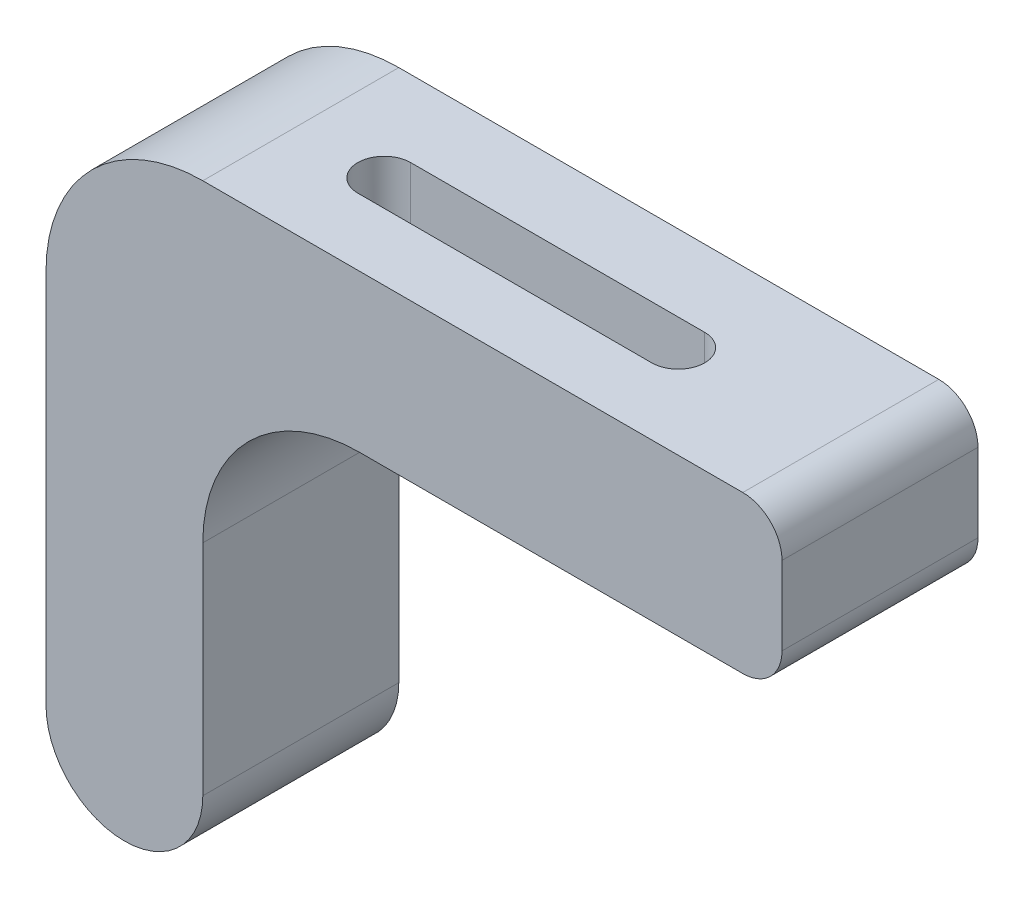
ISO-10303-21;
HEADER;
FILE_DESCRIPTION(('STEP AP214'),'2;1');
FILE_NAME('part.step','',(''),(''),'','','');
FILE_SCHEMA(('AUTOMOTIVE_DESIGN { 1 0 10303 214 1 1 1 1 }'));
ENDSEC;
DATA;
#1=APPLICATION_CONTEXT('core data for automotive mechanical design processes');
#2=APPLICATION_PROTOCOL_DEFINITION('international standard','automotive_design',2000,#1);
#3=PRODUCT_CONTEXT('',#1,'mechanical');
#4=PRODUCT('Part','Part','',(#3));
#5=PRODUCT_RELATED_PRODUCT_CATEGORY('part','',(#4));
#6=PRODUCT_DEFINITION_FORMATION('','',#4);
#7=PRODUCT_DEFINITION_CONTEXT('part definition',#1,'design');
#8=PRODUCT_DEFINITION('design','',#6,#7);
#9=PRODUCT_DEFINITION_SHAPE('','',#8);
#10=(LENGTH_UNIT() NAMED_UNIT(*) SI_UNIT(.MILLI.,.METRE.));
#11=(NAMED_UNIT(*) PLANE_ANGLE_UNIT() SI_UNIT($,.RADIAN.));
#12=(NAMED_UNIT(*) SI_UNIT($,.STERADIAN.) SOLID_ANGLE_UNIT());
#13=UNCERTAINTY_MEASURE_WITH_UNIT(LENGTH_MEASURE(1.E-05),#10,'distance_accuracy_value','');
#14=(GEOMETRIC_REPRESENTATION_CONTEXT(3) GLOBAL_UNCERTAINTY_ASSIGNED_CONTEXT((#13)) GLOBAL_UNIT_ASSIGNED_CONTEXT((#10,
#11,#12)) REPRESENTATION_CONTEXT('',''));
#15=CARTESIAN_POINT('',(0.,0.,0.));
#16=DIRECTION('',(0.,0.,1.));
#17=DIRECTION('',(1.,0.,0.));
#18=AXIS2_PLACEMENT_3D('',#15,#16,#17);
#19=CARTESIAN_POINT('',(4.,25.1351603178812,10.));
#20=DIRECTION('',(0.,0.,-1.));
#21=DIRECTION('',(-1.,0.,0.));
#22=AXIS2_PLACEMENT_3D('',#19,#20,#21);
#23=CYLINDRICAL_SURFACE('',#22,4.);
#24=CARTESIAN_POINT('',(4.,25.1351603178812,0.));
#25=DIRECTION('',(0.,0.,1.));
#26=DIRECTION('',(1.,0.,0.));
#27=AXIS2_PLACEMENT_3D('',#24,#25,#26);
#28=CIRCLE('',#27,4.);
#29=CARTESIAN_POINT('',(0.,25.1351603178812,0.));
#30=VERTEX_POINT('',#29);
#31=CARTESIAN_POINT('',(8.,25.1351603178812,0.));
#32=VERTEX_POINT('',#31);
#33=EDGE_CURVE('E252',#30,#32,#28,.T.);
#34=ORIENTED_EDGE('',*,*,#33,.T.);
#35=DIRECTION('',(0.,0.,-1.));
#36=VECTOR('',#35,1.);
#37=CARTESIAN_POINT('',(8.,25.1351603178812,10.));
#38=LINE('',#37,#36);
#39=CARTESIAN_POINT('',(8.,25.1351603178812,10.));
#40=VERTEX_POINT('',#39);
#41=EDGE_CURVE('E323',#40,#32,#38,.T.);
#42=ORIENTED_EDGE('',*,*,#41,.F.);
#43=CARTESIAN_POINT('',(4.,25.1351603178812,10.));
#44=DIRECTION('',(0.,0.,1.));
#45=DIRECTION('',(1.,0.,0.));
#46=AXIS2_PLACEMENT_3D('',#43,#44,#45);
#47=CIRCLE('',#46,4.);
#48=CARTESIAN_POINT('',(0.,25.1351603178812,10.));
#49=VERTEX_POINT('',#48);
#50=EDGE_CURVE('E253',#49,#40,#47,.T.);
#51=ORIENTED_EDGE('',*,*,#50,.F.);
#52=DIRECTION('',(0.,0.,-1.));
#53=VECTOR('',#52,1.);
#54=CARTESIAN_POINT('',(0.,25.1351603178812,10.));
#55=LINE('',#54,#53);
#56=EDGE_CURVE('E275',#49,#30,#55,.T.);
#57=ORIENTED_EDGE('',*,*,#56,.T.);
#58=EDGE_LOOP('',(#34,#42,#51,#57));
#59=FACE_BOUND('',#58,.T.);
#60=ADVANCED_FACE('F111',(#59),#23,.T.);
#61=CARTESIAN_POINT('',(8.,36.3101603178812,10.));
#62=DIRECTION('',(-1.,0.,0.));
#63=DIRECTION('',(0.,-1.,0.));
#64=AXIS2_PLACEMENT_3D('',#61,#62,#63);
#65=PLANE('',#64);
#66=DIRECTION('',(0.,1.,0.));
#67=VECTOR('',#66,1.);
#68=CARTESIAN_POINT('',(8.,36.3101603178812,0.));
#69=LINE('',#68,#67);
#70=CARTESIAN_POINT('',(8.,36.3101603178812,0.));
#71=VERTEX_POINT('',#70);
#72=EDGE_CURVE('E278',#32,#71,#69,.T.);
#73=ORIENTED_EDGE('',*,*,#72,.T.);
#74=DIRECTION('',(0.,0.,-1.));
#75=VECTOR('',#74,1.);
#76=CARTESIAN_POINT('',(8.,36.3101603178812,10.));
#77=LINE('',#76,#75);
#78=CARTESIAN_POINT('',(8.,36.3101603178812,10.));
#79=VERTEX_POINT('',#78);
#80=EDGE_CURVE('E320',#79,#71,#77,.T.);
#81=ORIENTED_EDGE('',*,*,#80,.F.);
#82=DIRECTION('',(0.,1.,0.));
#83=VECTOR('',#82,1.);
#84=CARTESIAN_POINT('',(8.,36.3101603178812,10.));
#85=LINE('',#84,#83);
#86=EDGE_CURVE('E256',#40,#79,#85,.T.);
#87=ORIENTED_EDGE('',*,*,#86,.F.);
#88=ORIENTED_EDGE('',*,*,#41,.T.);
#89=EDGE_LOOP('',(#73,#81,#87,#88));
#90=FACE_BOUND('',#89,.T.);
#91=ADVANCED_FACE('F381',(#90),#65,.F.);
#92=CARTESIAN_POINT('',(16.,36.3101603178812,10.));
#93=DIRECTION('',(0.,0.,-1.));
#94=DIRECTION('',(-1.,0.,0.));
#95=AXIS2_PLACEMENT_3D('',#92,#93,#94);
#96=CYLINDRICAL_SURFACE('',#95,8.);
#97=DIRECTION('',(0.,0.,-1.));
#98=VECTOR('',#97,1.);
#99=CARTESIAN_POINT('',(16.,44.3101603178812,10.));
#100=LINE('',#99,#98);
#101=CARTESIAN_POINT('',(16.,44.3101603178812,3.89366690571043));
#102=VERTEX_POINT('',#101);
#103=CARTESIAN_POINT('',(16.,44.3101603178812,0.));
#104=VERTEX_POINT('',#103);
#105=EDGE_CURVE('E316',#102,#104,#100,.T.);
#106=ORIENTED_EDGE('',*,*,#105,.F.);
#107=CARTESIAN_POINT('',(16.,36.3101603178812,3.89366690571043));
#108=DIRECTION('',(0.,0.,-1.));
#109=DIRECTION('',(-1.,0.,0.));
#110=AXIS2_PLACEMENT_3D('',#107,#108,#109);
#111=CIRCLE('',#110,8.);
#112=CARTESIAN_POINT('',(12.5,43.5039076028503,3.89366690571043));
#113=VERTEX_POINT('',#112);
#114=EDGE_CURVE('E13',#102,#113,#111,.F.);
#115=ORIENTED_EDGE('',*,*,#114,.T.);
#116=CARTESIAN_POINT('',(12.5,43.5039076028503,3.89366690571043));
#117=CARTESIAN_POINT('',(12.4568792266492,43.4829305534467,3.89366988853248));
#118=CARTESIAN_POINT('',(12.4139768552269,43.4615744304005,3.89573330868446));
#119=CARTESIAN_POINT('',(12.3288762981927,43.4182630152277,3.90387367539988));
#120=CARTESIAN_POINT('',(12.2866778992718,43.3963079101135,3.90994938270132));
#121=CARTESIAN_POINT('',(12.1615068561375,43.329766430829,3.9340345843684));
#122=CARTESIAN_POINT('',(12.0799508293661,43.2845002166307,3.9579021959188));
#123=CARTESIAN_POINT('',(11.9228969659407,43.1938706636955,4.02031076095494));
#124=CARTESIAN_POINT('',(11.8473942072144,43.1485074353039,4.05883964341761));
#125=CARTESIAN_POINT('',(11.7041868679636,43.0594626543818,4.14987997830283));
#126=CARTESIAN_POINT('',(11.6364792745771,43.0157804565018,4.20238600233969));
#127=CARTESIAN_POINT('',(11.5208249983929,42.9389642650322,4.31146008859584));
#128=CARTESIAN_POINT('',(11.4714444221209,42.9052501700856,4.36610110533769));
#129=CARTESIAN_POINT('',(11.3812897639014,42.8424284687943,4.48439136917584));
#130=CARTESIAN_POINT('',(11.3405045488239,42.8133149159924,4.54802878285641));
#131=CARTESIAN_POINT('',(11.275501482368,42.7661997688038,4.67173055068197));
#132=CARTESIAN_POINT('',(11.2496408508433,42.7471483066422,4.73052838305961));
#133=CARTESIAN_POINT('',(11.206247296153,42.7148984176408,4.85265118786445));
#134=CARTESIAN_POINT('',(11.1887089201268,42.7016961586968,4.91597316462278));
#135=CARTESIAN_POINT('',(11.1629123862382,42.6821972009173,5.04591760923964));
#136=CARTESIAN_POINT('',(11.1547057937154,42.6759388772701,5.11255631255122));
#137=CARTESIAN_POINT('',(11.1483390546551,42.6710883546664,5.24658657464524));
#138=CARTESIAN_POINT('',(11.1501756865252,42.6724936974145,5.31397788509037));
#139=CARTESIAN_POINT('',(11.1631144709057,42.6823333974581,5.44098752881625));
#140=CARTESIAN_POINT('',(11.1733477922782,42.6901085395098,5.50075016202871));
#141=CARTESIAN_POINT('',(11.2013846255585,42.7112223839951,5.61743238162298));
#142=CARTESIAN_POINT('',(11.2191897623024,42.7245622805578,5.67435135485241));
#143=CARTESIAN_POINT('',(11.2625834823447,42.7566821411344,5.78691395879046));
#144=CARTESIAN_POINT('',(11.2885107087085,42.7756966423167,5.84235843036063));
#145=CARTESIAN_POINT('',(11.3467707355907,42.8177518495974,5.94808940379682));
#146=CARTESIAN_POINT('',(11.3791062008078,42.8407942301124,5.99837374671122));
#147=CARTESIAN_POINT('',(11.4551778509317,42.8940108102114,6.10134133985325));
#148=CARTESIAN_POINT('',(11.4999170476168,42.9247324107086,6.15299916390679));
#149=CARTESIAN_POINT('',(11.595637545607,42.9888516321427,6.24825410841477));
#150=CARTESIAN_POINT('',(11.6466241272214,43.022251508413,6.29184433090327));
#151=CARTESIAN_POINT('',(11.7636341758201,43.0968271948156,6.377889468521));
#152=CARTESIAN_POINT('',(11.8307003432021,43.138305562963,6.41866950958618));
#153=CARTESIAN_POINT('',(11.9705722108428,43.2217701021334,6.48797257495263));
#154=CARTESIAN_POINT('',(12.0433770927082,43.2637562000291,6.51649734323903));
#155=CARTESIAN_POINT('',(12.1797096230503,43.3394062545707,6.5566834184057));
#156=CARTESIAN_POINT('',(12.2425449165135,43.3732064910614,6.57045725951368));
#157=CARTESIAN_POINT('',(12.3700879570957,43.4396053574038,6.58894442385595));
#158=CARTESIAN_POINT('',(12.4347943146397,43.4722048400778,6.59366430420605));
#159=CARTESIAN_POINT('',(12.5,43.5039076028503,6.59366690571043));
#160=B_SPLINE_CURVE_WITH_KNOTS('',3,(#116,#117,#118,#119,#120,#121,#122,#123,#124,#125,#126,
#127,#128,#129,#130,#131,#132,#133,#134,#135,#136,#137,#138,#139,#140,#141,#142,#143,#144,#145,
#146,#147,#148,#149,#150,#151,#152,#153,#154,#155,#156,#157,#158,#159),.UNSPECIFIED.,.F.,.F.,(4,
2,2,2,2,2,2,2,2,2,2,2,2,2,2,2,2,2,2,2,2,4),(0.,0.143754946014148,0.287465511662691,
0.574861811524335,0.862022000375852,1.14907082541699,1.39112169181611,1.63285708865541,
1.83303460615649,2.03308078276552,2.2342270782765,2.43530885533094,2.61787314426836,
2.80047662946499,2.99202781599771,3.18365882184822,3.40760541275376,3.63174260684776,
3.89699280727686,4.1622052487955,4.37962657356354,4.59689037656974),.UNSPECIFIED.);
#161=CARTESIAN_POINT('',(12.5,43.5039076028503,6.59366690571043));
#162=VERTEX_POINT('',#161);
#163=EDGE_CURVE('E326',#113,#162,#160,.T.);
#164=ORIENTED_EDGE('',*,*,#163,.T.);
#165=CARTESIAN_POINT('',(16.,36.3101603178812,6.59366690571043));
#166=DIRECTION('',(0.,0.,1.));
#167=DIRECTION('',(1.,0.,0.));
#168=AXIS2_PLACEMENT_3D('',#165,#166,#167);
#169=CIRCLE('',#168,8.);
#170=CARTESIAN_POINT('',(16.,44.3101603178812,6.59366690571043));
#171=VERTEX_POINT('',#170);
#172=EDGE_CURVE('E118',#162,#171,#169,.F.);
#173=ORIENTED_EDGE('',*,*,#172,.T.);
#174=CARTESIAN_POINT('',(16.,44.3101603178812,10.));
#175=VERTEX_POINT('',#174);
#176=EDGE_CURVE('E317',#175,#171,#100,.T.);
#177=ORIENTED_EDGE('',*,*,#176,.F.);
#178=CARTESIAN_POINT('',(16.,36.3101603178812,10.));
#179=DIRECTION('',(0.,0.,-1.));
#180=DIRECTION('',(1.,0.,0.));
#181=AXIS2_PLACEMENT_3D('',#178,#179,#180);
#182=CIRCLE('',#181,8.);
#183=EDGE_CURVE('E259',#79,#175,#182,.T.);
#184=ORIENTED_EDGE('',*,*,#183,.F.);
#185=ORIENTED_EDGE('',*,*,#80,.T.);
#186=CARTESIAN_POINT('',(16.,36.3101603178812,0.));
#187=DIRECTION('',(0.,0.,-1.));
#188=DIRECTION('',(1.,0.,0.));
#189=AXIS2_PLACEMENT_3D('',#186,#187,#188);
#190=CIRCLE('',#189,8.);
#191=EDGE_CURVE('E280',#71,#104,#190,.T.);
#192=ORIENTED_EDGE('',*,*,#191,.T.);
#193=EDGE_LOOP('',(#106,#115,#164,#173,#177,#184,#185,#192));
#194=FACE_BOUND('',#193,.T.);
#195=ADVANCED_FACE('F334',(#194),#96,.F.);
#196=CARTESIAN_POINT('',(35.5499999999999,44.3101603178812,10.));
#197=DIRECTION('',(0.,1.,0.));
#198=DIRECTION('',(-1.,0.,0.));
#199=AXIS2_PLACEMENT_3D('',#196,#197,#198);
#200=PLANE('',#199);
#201=ORIENTED_EDGE('',*,*,#176,.T.);
#202=DIRECTION('',(1.,0.,0.));
#203=VECTOR('',#202,1.);
#204=CARTESIAN_POINT('',(35.5499999999999,44.3101603178812,6.59366690571043));
#205=LINE('',#204,#203);
#206=CARTESIAN_POINT('',(27.5,44.3101603178812,6.59366690571043));
#207=VERTEX_POINT('',#206);
#208=EDGE_CURVE('E246',#171,#207,#205,.T.);
#209=ORIENTED_EDGE('',*,*,#208,.T.);
#210=CARTESIAN_POINT('',(27.5,44.3101603178812,5.24366690571043));
#211=DIRECTION('',(0.,1.,0.));
#212=DIRECTION('',(-1.,0.,0.));
#213=AXIS2_PLACEMENT_3D('',#210,#211,#212);
#214=CIRCLE('',#213,1.35);
#215=CARTESIAN_POINT('',(27.5,44.3101603178812,3.89366690571043));
#216=VERTEX_POINT('',#215);
#217=EDGE_CURVE('E250',#207,#216,#214,.T.);
#218=ORIENTED_EDGE('',*,*,#217,.T.);
#219=DIRECTION('',(-1.,0.,0.));
#220=VECTOR('',#219,1.);
#221=CARTESIAN_POINT('',(35.5499999999999,44.3101603178812,3.89366690571043));
#222=LINE('',#221,#220);
#223=EDGE_CURVE('E222',#216,#102,#222,.T.);
#224=ORIENTED_EDGE('',*,*,#223,.T.);
#225=ORIENTED_EDGE('',*,*,#105,.T.);
#226=DIRECTION('',(1.,0.,0.));
#227=VECTOR('',#226,1.);
#228=CARTESIAN_POINT('',(35.5499999999999,44.3101603178812,0.));
#229=LINE('',#228,#227);
#230=CARTESIAN_POINT('',(35.5499999999999,44.3101603178812,0.));
#231=VERTEX_POINT('',#230);
#232=EDGE_CURVE('E283',#104,#231,#229,.T.);
#233=ORIENTED_EDGE('',*,*,#232,.T.);
#234=DIRECTION('',(0.,0.,-1.));
#235=VECTOR('',#234,1.);
#236=CARTESIAN_POINT('',(35.5499999999999,44.3101603178812,10.));
#237=LINE('',#236,#235);
#238=CARTESIAN_POINT('',(35.5499999999999,44.3101603178812,10.));
#239=VERTEX_POINT('',#238);
#240=EDGE_CURVE('E313',#239,#231,#237,.T.);
#241=ORIENTED_EDGE('',*,*,#240,.F.);
#242=DIRECTION('',(1.,0.,0.));
#243=VECTOR('',#242,1.);
#244=CARTESIAN_POINT('',(35.5499999999999,44.3101603178812,10.));
#245=LINE('',#244,#243);
#246=EDGE_CURVE('E261',#175,#239,#245,.T.);
#247=ORIENTED_EDGE('',*,*,#246,.F.);
#248=EDGE_LOOP('',(#201,#209,#218,#224,#225,#233,#241,#247));
#249=FACE_BOUND('',#248,.T.);
#250=ADVANCED_FACE('F374',(#249),#200,.F.);
#251=CARTESIAN_POINT('',(35.5499999999999,46.3101603178812,10.));
#252=DIRECTION('',(0.,0.,-1.));
#253=DIRECTION('',(-1.,0.,0.));
#254=AXIS2_PLACEMENT_3D('',#251,#252,#253);
#255=CYLINDRICAL_SURFACE('',#254,2.);
#256=CARTESIAN_POINT('',(35.5499999999999,46.3101603178812,0.));
#257=DIRECTION('',(0.,0.,1.));
#258=DIRECTION('',(-1.,0.,0.));
#259=AXIS2_PLACEMENT_3D('',#256,#257,#258);
#260=CIRCLE('',#259,2.);
#261=CARTESIAN_POINT('',(37.5499999999999,46.3101603178812,0.));
#262=VERTEX_POINT('',#261);
#263=EDGE_CURVE('E285',#231,#262,#260,.T.);
#264=ORIENTED_EDGE('',*,*,#263,.T.);
#265=DIRECTION('',(0.,0.,-1.));
#266=VECTOR('',#265,1.);
#267=CARTESIAN_POINT('',(37.5499999999999,46.3101603178812,10.));
#268=LINE('',#267,#266);
#269=CARTESIAN_POINT('',(37.5499999999999,46.3101603178812,10.));
#270=VERTEX_POINT('',#269);
#271=EDGE_CURVE('E310',#270,#262,#268,.T.);
#272=ORIENTED_EDGE('',*,*,#271,.F.);
#273=CARTESIAN_POINT('',(35.5499999999999,46.3101603178812,10.));
#274=DIRECTION('',(0.,0.,1.));
#275=DIRECTION('',(-1.,0.,0.));
#276=AXIS2_PLACEMENT_3D('',#273,#274,#275);
#277=CIRCLE('',#276,2.);
#278=EDGE_CURVE('E263',#239,#270,#277,.T.);
#279=ORIENTED_EDGE('',*,*,#278,.F.);
#280=ORIENTED_EDGE('',*,*,#240,.T.);
#281=EDGE_LOOP('',(#264,#272,#279,#280));
#282=FACE_BOUND('',#281,.T.);
#283=ADVANCED_FACE('F371',(#282),#255,.T.);
#284=CARTESIAN_POINT('',(37.5499999999999,50.3101603178812,10.));
#285=DIRECTION('',(-1.,0.,0.));
#286=DIRECTION('',(0.,0.,1.));
#287=AXIS2_PLACEMENT_3D('',#284,#285,#286);
#288=PLANE('',#287);
#289=DIRECTION('',(0.,1.,0.));
#290=VECTOR('',#289,1.);
#291=CARTESIAN_POINT('',(37.5499999999999,50.3101603178812,0.));
#292=LINE('',#291,#290);
#293=CARTESIAN_POINT('',(37.5499999999999,50.3101603178812,0.));
#294=VERTEX_POINT('',#293);
#295=EDGE_CURVE('E287',#262,#294,#292,.T.);
#296=ORIENTED_EDGE('',*,*,#295,.T.);
#297=DIRECTION('',(0.,0.,-1.));
#298=VECTOR('',#297,1.);
#299=CARTESIAN_POINT('',(37.5499999999999,50.3101603178812,10.));
#300=LINE('',#299,#298);
#301=CARTESIAN_POINT('',(37.5499999999999,50.3101603178812,10.));
#302=VERTEX_POINT('',#301);
#303=EDGE_CURVE('E307',#302,#294,#300,.T.);
#304=ORIENTED_EDGE('',*,*,#303,.F.);
#305=DIRECTION('',(0.,1.,0.));
#306=VECTOR('',#305,1.);
#307=CARTESIAN_POINT('',(37.5499999999999,50.3101603178812,10.));
#308=LINE('',#307,#306);
#309=EDGE_CURVE('E265',#270,#302,#308,.T.);
#310=ORIENTED_EDGE('',*,*,#309,.F.);
#311=ORIENTED_EDGE('',*,*,#271,.T.);
#312=EDGE_LOOP('',(#296,#304,#310,#311));
#313=FACE_BOUND('',#312,.T.);
#314=ADVANCED_FACE('F367',(#313),#288,.F.);
#315=CARTESIAN_POINT('',(35.5499999999999,50.3101603178812,10.));
#316=DIRECTION('',(0.,0.,-1.));
#317=DIRECTION('',(-1.,0.,0.));
#318=AXIS2_PLACEMENT_3D('',#315,#316,#317);
#319=CYLINDRICAL_SURFACE('',#318,2.);
#320=CARTESIAN_POINT('',(35.5499999999999,50.3101603178812,0.));
#321=DIRECTION('',(0.,0.,1.));
#322=DIRECTION('',(-1.,0.,0.));
#323=AXIS2_PLACEMENT_3D('',#320,#321,#322);
#324=CIRCLE('',#323,2.);
#325=CARTESIAN_POINT('',(35.5499999999999,52.3101603178812,0.));
#326=VERTEX_POINT('',#325);
#327=EDGE_CURVE('E289',#294,#326,#324,.T.);
#328=ORIENTED_EDGE('',*,*,#327,.T.);
#329=DIRECTION('',(0.,0.,-1.));
#330=VECTOR('',#329,1.);
#331=CARTESIAN_POINT('',(35.5499999999999,52.3101603178812,10.));
#332=LINE('',#331,#330);
#333=CARTESIAN_POINT('',(35.5499999999999,52.3101603178812,10.));
#334=VERTEX_POINT('',#333);
#335=EDGE_CURVE('E304',#334,#326,#332,.T.);
#336=ORIENTED_EDGE('',*,*,#335,.F.);
#337=CARTESIAN_POINT('',(35.5499999999999,50.3101603178812,10.));
#338=DIRECTION('',(0.,0.,1.));
#339=DIRECTION('',(-1.,0.,0.));
#340=AXIS2_PLACEMENT_3D('',#337,#338,#339);
#341=CIRCLE('',#340,2.);
#342=EDGE_CURVE('E267',#302,#334,#341,.T.);
#343=ORIENTED_EDGE('',*,*,#342,.F.);
#344=ORIENTED_EDGE('',*,*,#303,.T.);
#345=EDGE_LOOP('',(#328,#336,#343,#344));
#346=FACE_BOUND('',#345,.T.);
#347=ADVANCED_FACE('F364',(#346),#319,.T.);
#348=CARTESIAN_POINT('',(8.,52.3101603178812,10.));
#349=DIRECTION('',(0.,-1.,0.));
#350=DIRECTION('',(1.,0.,0.));
#351=AXIS2_PLACEMENT_3D('',#348,#349,#350);
#352=PLANE('',#351);
#353=CARTESIAN_POINT('',(27.5,52.3101603178812,5.24366690571043));
#354=DIRECTION('',(0.,1.,0.));
#355=DIRECTION('',(0.,0.,1.));
#356=AXIS2_PLACEMENT_3D('',#353,#354,#355);
#357=CIRCLE('',#356,1.35);
#358=CARTESIAN_POINT('',(27.5,52.3101603178812,6.59366690571045));
#359=VERTEX_POINT('',#358);
#360=CARTESIAN_POINT('',(27.5,52.3101603178812,3.89366690571043));
#361=VERTEX_POINT('',#360);
#362=EDGE_CURVE('E226',#359,#361,#357,.T.);
#363=ORIENTED_EDGE('',*,*,#362,.F.);
#364=DIRECTION('',(1.,0.,0.));
#365=VECTOR('',#364,1.);
#366=CARTESIAN_POINT('',(12.5,52.3101603178812,6.59366690571045));
#367=LINE('',#366,#365);
#368=CARTESIAN_POINT('',(12.5,52.3101603178812,6.59366690571043));
#369=VERTEX_POINT('',#368);
#370=EDGE_CURVE('E238',#369,#359,#367,.T.);
#371=ORIENTED_EDGE('',*,*,#370,.F.);
#372=CARTESIAN_POINT('',(12.5,52.3101603178812,5.24366690571043));
#373=DIRECTION('',(0.,1.,0.));
#374=DIRECTION('',(0.,0.,1.));
#375=AXIS2_PLACEMENT_3D('',#372,#373,#374);
#376=CIRCLE('',#375,1.35);
#377=CARTESIAN_POINT('',(12.5,52.3101603178812,3.89366690571043));
#378=VERTEX_POINT('',#377);
#379=EDGE_CURVE('E237',#378,#369,#376,.T.);
#380=ORIENTED_EDGE('',*,*,#379,.F.);
#381=DIRECTION('',(1.,0.,0.));
#382=VECTOR('',#381,1.);
#383=CARTESIAN_POINT('',(12.5,52.3101603178812,3.89366690571043));
#384=LINE('',#383,#382);
#385=EDGE_CURVE('E219',#378,#361,#384,.T.);
#386=ORIENTED_EDGE('',*,*,#385,.T.);
#387=EDGE_LOOP('',(#363,#371,#380,#386));
#388=FACE_BOUND('',#387,.T.);
#389=DIRECTION('',(-1.,0.,0.));
#390=VECTOR('',#389,1.);
#391=CARTESIAN_POINT('',(8.,52.3101603178812,0.));
#392=LINE('',#391,#390);
#393=CARTESIAN_POINT('',(8.,52.3101603178812,0.));
#394=VERTEX_POINT('',#393);
#395=EDGE_CURVE('E291',#326,#394,#392,.T.);
#396=ORIENTED_EDGE('',*,*,#395,.T.);
#397=DIRECTION('',(0.,0.,-1.));
#398=VECTOR('',#397,1.);
#399=CARTESIAN_POINT('',(8.,52.3101603178812,10.));
#400=LINE('',#399,#398);
#401=CARTESIAN_POINT('',(8.,52.3101603178812,10.));
#402=VERTEX_POINT('',#401);
#403=EDGE_CURVE('E301',#402,#394,#400,.T.);
#404=ORIENTED_EDGE('',*,*,#403,.F.);
#405=DIRECTION('',(-1.,0.,0.));
#406=VECTOR('',#405,1.);
#407=CARTESIAN_POINT('',(8.,52.3101603178812,10.));
#408=LINE('',#407,#406);
#409=EDGE_CURVE('E269',#334,#402,#408,.T.);
#410=ORIENTED_EDGE('',*,*,#409,.F.);
#411=ORIENTED_EDGE('',*,*,#335,.T.);
#412=EDGE_LOOP('',(#396,#404,#410,#411));
#413=FACE_BOUND('',#412,.T.);
#414=ADVANCED_FACE('F235',(#388,#413),#352,.F.);
#415=CARTESIAN_POINT('',(8.,44.3101603178812,10.));
#416=DIRECTION('',(0.,0.,-1.));
#417=DIRECTION('',(-1.,0.,0.));
#418=AXIS2_PLACEMENT_3D('',#415,#416,#417);
#419=CYLINDRICAL_SURFACE('',#418,8.);
#420=CARTESIAN_POINT('',(8.,44.3101603178812,0.));
#421=DIRECTION('',(0.,0.,1.));
#422=DIRECTION('',(-1.,0.,0.));
#423=AXIS2_PLACEMENT_3D('',#420,#421,#422);
#424=CIRCLE('',#423,8.);
#425=CARTESIAN_POINT('',(0.,44.3101603178812,0.));
#426=VERTEX_POINT('',#425);
#427=EDGE_CURVE('E293',#394,#426,#424,.T.);
#428=ORIENTED_EDGE('',*,*,#427,.T.);
#429=DIRECTION('',(0.,0.,-1.));
#430=VECTOR('',#429,1.);
#431=CARTESIAN_POINT('',(0.,44.3101603178812,10.));
#432=LINE('',#431,#430);
#433=CARTESIAN_POINT('',(0.,44.3101603178812,10.));
#434=VERTEX_POINT('',#433);
#435=EDGE_CURVE('E298',#434,#426,#432,.T.);
#436=ORIENTED_EDGE('',*,*,#435,.F.);
#437=CARTESIAN_POINT('',(8.,44.3101603178812,10.));
#438=DIRECTION('',(0.,0.,1.));
#439=DIRECTION('',(-1.,0.,0.));
#440=AXIS2_PLACEMENT_3D('',#437,#438,#439);
#441=CIRCLE('',#440,8.);
#442=EDGE_CURVE('E271',#402,#434,#441,.T.);
#443=ORIENTED_EDGE('',*,*,#442,.F.);
#444=ORIENTED_EDGE('',*,*,#403,.T.);
#445=EDGE_LOOP('',(#428,#436,#443,#444));
#446=FACE_BOUND('',#445,.T.);
#447=ADVANCED_FACE('F357',(#446),#419,.T.);
#448=CARTESIAN_POINT('',(0.,25.1351603178812,10.));
#449=DIRECTION('',(1.,0.,0.));
#450=DIRECTION('',(0.,1.,0.));
#451=AXIS2_PLACEMENT_3D('',#448,#449,#450);
#452=PLANE('',#451);
#453=DIRECTION('',(0.,-1.,0.));
#454=VECTOR('',#453,1.);
#455=CARTESIAN_POINT('',(0.,25.1351603178812,0.));
#456=LINE('',#455,#454);
#457=EDGE_CURVE('E257',#426,#30,#456,.T.);
#458=ORIENTED_EDGE('',*,*,#457,.T.);
#459=ORIENTED_EDGE('',*,*,#56,.F.);
#460=DIRECTION('',(0.,-1.,0.));
#461=VECTOR('',#460,1.);
#462=CARTESIAN_POINT('',(0.,25.1351603178812,10.));
#463=LINE('',#462,#461);
#464=EDGE_CURVE('E273',#434,#49,#463,.T.);
#465=ORIENTED_EDGE('',*,*,#464,.F.);
#466=ORIENTED_EDGE('',*,*,#435,.T.);
#467=EDGE_LOOP('',(#458,#459,#465,#466));
#468=FACE_BOUND('',#467,.T.);
#469=ADVANCED_FACE('F350',(#468),#452,.F.);
#470=CARTESIAN_POINT('',(4.,25.1351603178812,10.));
#471=DIRECTION('',(0.,0.,1.));
#472=DIRECTION('',(1.,0.,0.));
#473=AXIS2_PLACEMENT_3D('',#470,#471,#472);
#474=PLANE('',#473);
#475=ORIENTED_EDGE('',*,*,#50,.T.);
#476=ORIENTED_EDGE('',*,*,#86,.T.);
#477=ORIENTED_EDGE('',*,*,#183,.T.);
#478=ORIENTED_EDGE('',*,*,#246,.T.);
#479=ORIENTED_EDGE('',*,*,#278,.T.);
#480=ORIENTED_EDGE('',*,*,#309,.T.);
#481=ORIENTED_EDGE('',*,*,#342,.T.);
#482=ORIENTED_EDGE('',*,*,#409,.T.);
#483=ORIENTED_EDGE('',*,*,#442,.T.);
#484=ORIENTED_EDGE('',*,*,#464,.T.);
#485=EDGE_LOOP('',(#475,#476,#477,#478,#479,#480,#481,#482,#483,#484));
#486=FACE_BOUND('',#485,.T.);
#487=ADVANCED_FACE('F347',(#486),#474,.T.);
#488=CARTESIAN_POINT('',(4.,25.1351603178812,0.));
#489=DIRECTION('',(0.,0.,1.));
#490=DIRECTION('',(1.,0.,0.));
#491=AXIS2_PLACEMENT_3D('',#488,#489,#490);
#492=PLANE('',#491);
#493=ORIENTED_EDGE('',*,*,#33,.F.);
#494=ORIENTED_EDGE('',*,*,#457,.F.);
#495=ORIENTED_EDGE('',*,*,#427,.F.);
#496=ORIENTED_EDGE('',*,*,#395,.F.);
#497=ORIENTED_EDGE('',*,*,#327,.F.);
#498=ORIENTED_EDGE('',*,*,#295,.F.);
#499=ORIENTED_EDGE('',*,*,#263,.F.);
#500=ORIENTED_EDGE('',*,*,#232,.F.);
#501=ORIENTED_EDGE('',*,*,#191,.F.);
#502=ORIENTED_EDGE('',*,*,#72,.F.);
#503=EDGE_LOOP('',(#493,#494,#495,#496,#497,#498,#499,#500,#501,#502));
#504=FACE_BOUND('',#503,.T.);
#505=ADVANCED_FACE('F346',(#504),#492,.F.);
#506=CARTESIAN_POINT('',(27.5,52.3101603178812,5.24366690571043));
#507=DIRECTION('',(0.,1.,0.));
#508=DIRECTION('',(0.,0.,1.));
#509=AXIS2_PLACEMENT_3D('',#506,#507,#508);
#510=CYLINDRICAL_SURFACE('',#509,1.35);
#511=DIRECTION('',(0.,1.,0.));
#512=VECTOR('',#511,1.);
#513=CARTESIAN_POINT('',(27.5,52.3101603178812,6.59366690571043));
#514=LINE('',#513,#512);
#515=EDGE_CURVE('E225',#359,#207,#514,.F.);
#516=ORIENTED_EDGE('',*,*,#515,.F.);
#517=ORIENTED_EDGE('',*,*,#362,.T.);
#518=DIRECTION('',(0.,1.,0.));
#519=VECTOR('',#518,1.);
#520=CARTESIAN_POINT('',(27.5,52.3101603178812,3.89366690571043));
#521=LINE('',#520,#519);
#522=EDGE_CURVE('E215',#216,#361,#521,.T.);
#523=ORIENTED_EDGE('',*,*,#522,.F.);
#524=ORIENTED_EDGE('',*,*,#217,.F.);
#525=EDGE_LOOP('',(#516,#517,#523,#524));
#526=FACE_BOUND('',#525,.T.);
#527=ADVANCED_FACE('F230',(#526),#510,.F.);
#528=CARTESIAN_POINT('',(12.5,52.3101603178812,3.89366690571043));
#529=DIRECTION('',(0.,0.,-1.));
#530=DIRECTION('',(-1.,0.,0.));
#531=AXIS2_PLACEMENT_3D('',#528,#529,#530);
#532=PLANE('',#531);
#533=ORIENTED_EDGE('',*,*,#522,.T.);
#534=ORIENTED_EDGE('',*,*,#385,.F.);
#535=DIRECTION('',(0.,1.,0.));
#536=VECTOR('',#535,1.);
#537=CARTESIAN_POINT('',(12.5,52.3101603178812,3.89366690571043));
#538=LINE('',#537,#536);
#539=EDGE_CURVE('E125',#378,#113,#538,.F.);
#540=ORIENTED_EDGE('',*,*,#539,.T.);
#541=ORIENTED_EDGE('',*,*,#114,.F.);
#542=ORIENTED_EDGE('',*,*,#223,.F.);
#543=EDGE_LOOP('',(#533,#534,#540,#541,#542));
#544=FACE_BOUND('',#543,.T.);
#545=ADVANCED_FACE('F217',(#544),#532,.F.);
#546=CARTESIAN_POINT('',(12.5,52.3101603178812,6.59366690571043));
#547=DIRECTION('',(0.,0.,1.));
#548=DIRECTION('',(1.,0.,0.));
#549=AXIS2_PLACEMENT_3D('',#546,#547,#548);
#550=PLANE('',#549);
#551=ORIENTED_EDGE('',*,*,#172,.F.);
#552=DIRECTION('',(0.,1.,0.));
#553=VECTOR('',#552,1.);
#554=CARTESIAN_POINT('',(12.5,52.3101603178812,6.59366690571043));
#555=LINE('',#554,#553);
#556=EDGE_CURVE('E130',#162,#369,#555,.T.);
#557=ORIENTED_EDGE('',*,*,#556,.T.);
#558=ORIENTED_EDGE('',*,*,#370,.T.);
#559=ORIENTED_EDGE('',*,*,#515,.T.);
#560=ORIENTED_EDGE('',*,*,#208,.F.);
#561=EDGE_LOOP('',(#551,#557,#558,#559,#560));
#562=FACE_BOUND('',#561,.T.);
#563=ADVANCED_FACE('F342',(#562),#550,.F.);
#564=CARTESIAN_POINT('',(12.5,52.3101603178812,5.24366690571043));
#565=DIRECTION('',(0.,1.,0.));
#566=DIRECTION('',(0.,0.,1.));
#567=AXIS2_PLACEMENT_3D('',#564,#565,#566);
#568=CYLINDRICAL_SURFACE('',#567,1.35);
#569=ORIENTED_EDGE('',*,*,#539,.F.);
#570=ORIENTED_EDGE('',*,*,#379,.T.);
#571=ORIENTED_EDGE('',*,*,#556,.F.);
#572=ORIENTED_EDGE('',*,*,#163,.F.);
#573=EDGE_LOOP('',(#569,#570,#571,#572));
#574=FACE_BOUND('',#573,.T.);
#575=ADVANCED_FACE('F337',(#574),#568,.F.);
#576=CLOSED_SHELL('',(#60,#91,#195,#250,#283,#314,#347,#414,#447,#469,#487,#505,#527,#545,#563,#575));
#577=MANIFOLD_SOLID_BREP('B2',#576);
#578=ADVANCED_BREP_SHAPE_REPRESENTATION('',(#18,#577),#14);
#579=SHAPE_DEFINITION_REPRESENTATION(#9,#578);
ENDSEC;
END-ISO-10303-21;
